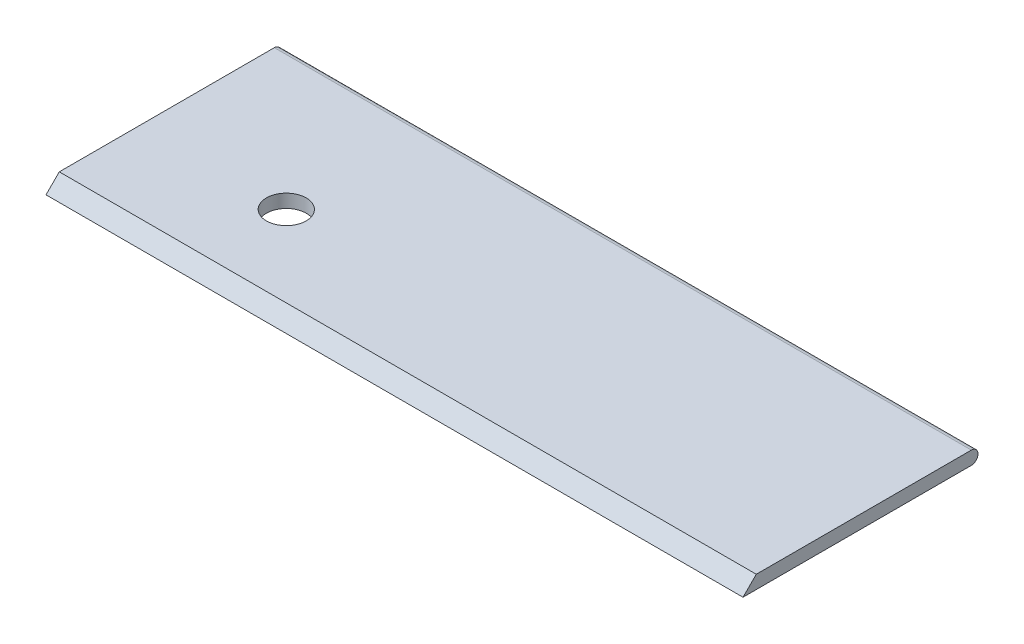
ISO-10303-21;
HEADER;
FILE_DESCRIPTION(('STEP AP214'),'2;1');
FILE_NAME('part.step','',(''),(''),'','','');
FILE_SCHEMA(('AUTOMOTIVE_DESIGN { 1 0 10303 214 1 1 1 1 }'));
ENDSEC;
DATA;
#1=APPLICATION_CONTEXT('core data for automotive mechanical design processes');
#2=APPLICATION_PROTOCOL_DEFINITION('international standard','automotive_design',2000,#1);
#3=PRODUCT_CONTEXT('',#1,'mechanical');
#4=PRODUCT('Part','Part','',(#3));
#5=PRODUCT_RELATED_PRODUCT_CATEGORY('part','',(#4));
#6=PRODUCT_DEFINITION_FORMATION('','',#4);
#7=PRODUCT_DEFINITION_CONTEXT('part definition',#1,'design');
#8=PRODUCT_DEFINITION('design','',#6,#7);
#9=PRODUCT_DEFINITION_SHAPE('','',#8);
#10=(LENGTH_UNIT() NAMED_UNIT(*) SI_UNIT(.MILLI.,.METRE.));
#11=(NAMED_UNIT(*) PLANE_ANGLE_UNIT() SI_UNIT($,.RADIAN.));
#12=(NAMED_UNIT(*) SI_UNIT($,.STERADIAN.) SOLID_ANGLE_UNIT());
#13=UNCERTAINTY_MEASURE_WITH_UNIT(LENGTH_MEASURE(1.E-05),#10,'distance_accuracy_value','');
#14=(GEOMETRIC_REPRESENTATION_CONTEXT(3) GLOBAL_UNCERTAINTY_ASSIGNED_CONTEXT((#13)) GLOBAL_UNIT_ASSIGNED_CONTEXT((#10,
#11,#12)) REPRESENTATION_CONTEXT('',''));
#15=CARTESIAN_POINT('',(0.,0.,0.));
#16=DIRECTION('',(0.,0.,1.));
#17=DIRECTION('',(1.,0.,0.));
#18=AXIS2_PLACEMENT_3D('',#15,#16,#17);
#19=CARTESIAN_POINT('',(0.,0.,0.));
#20=DIRECTION('',(0.,1.,0.));
#21=DIRECTION('',(0.,0.,1.));
#22=AXIS2_PLACEMENT_3D('',#19,#20,#21);
#23=PLANE('',#22);
#24=CARTESIAN_POINT('',(38.1,0.,16.764));
#25=DIRECTION('',(0.,1.,0.));
#26=DIRECTION('',(0.,0.,1.));
#27=AXIS2_PLACEMENT_3D('',#24,#25,#26);
#28=CIRCLE('',#27,1.524);
#29=CARTESIAN_POINT('',(38.1,0.,18.288));
#30=VERTEX_POINT('',#29);
#31=EDGE_CURVE('E549',#30,#30,#28,.T.);
#32=ORIENTED_EDGE('',*,*,#31,.T.);
#33=EDGE_LOOP('',(#32));
#34=FACE_BOUND('',#33,.T.);
#35=CARTESIAN_POINT('',(17.78,0.,16.764));
#36=DIRECTION('',(0.,1.,0.));
#37=DIRECTION('',(0.,0.,1.));
#38=AXIS2_PLACEMENT_3D('',#35,#36,#37);
#39=CIRCLE('',#38,1.524);
#40=CARTESIAN_POINT('',(17.78,0.,18.288));
#41=VERTEX_POINT('',#40);
#42=EDGE_CURVE('E551',#41,#41,#39,.T.);
#43=ORIENTED_EDGE('',*,*,#42,.T.);
#44=EDGE_LOOP('',(#43));
#45=FACE_BOUND('',#44,.T.);
#46=CARTESIAN_POINT('',(20.955,0.,5.9436));
#47=DIRECTION('',(0.,-1.,0.));
#48=DIRECTION('',(0.,0.,-1.));
#49=AXIS2_PLACEMENT_3D('',#46,#47,#48);
#50=CIRCLE('',#49,1.4986);
#51=CARTESIAN_POINT('',(20.955,0.,4.445));
#52=VERTEX_POINT('',#51);
#53=EDGE_CURVE('E218',#52,#52,#50,.T.);
#54=ORIENTED_EDGE('',*,*,#53,.F.);
#55=EDGE_LOOP('',(#54));
#56=FACE_BOUND('',#55,.T.);
#57=CARTESIAN_POINT('',(30.9626,0.,5.9436));
#58=DIRECTION('',(0.,-1.,0.));
#59=DIRECTION('',(0.,0.,-1.));
#60=AXIS2_PLACEMENT_3D('',#57,#58,#59);
#61=CIRCLE('',#60,1.4986);
#62=CARTESIAN_POINT('',(30.9626,0.,4.445));
#63=VERTEX_POINT('',#62);
#64=EDGE_CURVE('E231',#63,#63,#61,.T.);
#65=ORIENTED_EDGE('',*,*,#64,.F.);
#66=EDGE_LOOP('',(#65));
#67=FACE_BOUND('',#66,.T.);
#68=CARTESIAN_POINT('',(102.3874,0.,5.9436));
#69=DIRECTION('',(0.,-1.,0.));
#70=DIRECTION('',(0.,0.,-1.));
#71=AXIS2_PLACEMENT_3D('',#68,#69,#70);
#72=CIRCLE('',#71,1.4986);
#73=CARTESIAN_POINT('',(102.3874,0.,4.44499999999999));
#74=VERTEX_POINT('',#73);
#75=EDGE_CURVE('E237',#74,#74,#72,.T.);
#76=ORIENTED_EDGE('',*,*,#75,.F.);
#77=EDGE_LOOP('',(#76));
#78=FACE_BOUND('',#77,.T.);
#79=CARTESIAN_POINT('',(112.395,0.,5.9436));
#80=DIRECTION('',(0.,-1.,0.));
#81=DIRECTION('',(0.,0.,-1.));
#82=AXIS2_PLACEMENT_3D('',#79,#80,#81);
#83=CIRCLE('',#82,1.4986);
#84=CARTESIAN_POINT('',(112.395,0.,4.44499999999999));
#85=VERTEX_POINT('',#84);
#86=EDGE_CURVE('E243',#85,#85,#83,.T.);
#87=ORIENTED_EDGE('',*,*,#86,.F.);
#88=EDGE_LOOP('',(#87));
#89=FACE_BOUND('',#88,.T.);
#90=DIRECTION('',(0.,0.,1.));
#91=VECTOR('',#90,1.);
#92=CARTESIAN_POINT('',(0.,0.,0.));
#93=LINE('',#92,#91);
#94=CARTESIAN_POINT('',(0.,0.,1.27));
#95=VERTEX_POINT('',#94);
#96=CARTESIAN_POINT('',(0.,0.,44.958));
#97=VERTEX_POINT('',#96);
#98=EDGE_CURVE('E161',#95,#97,#93,.T.);
#99=ORIENTED_EDGE('',*,*,#98,.F.);
#100=DIRECTION('',(-1.,0.,0.));
#101=VECTOR('',#100,1.);
#102=CARTESIAN_POINT('',(0.,0.,1.27));
#103=LINE('',#102,#101);
#104=CARTESIAN_POINT('',(133.35,0.,1.27));
#105=VERTEX_POINT('',#104);
#106=EDGE_CURVE('E11',#95,#105,#103,.F.);
#107=ORIENTED_EDGE('',*,*,#106,.T.);
#108=DIRECTION('',(0.,0.,-1.));
#109=VECTOR('',#108,1.);
#110=CARTESIAN_POINT('',(133.35,0.,0.));
#111=LINE('',#110,#109);
#112=CARTESIAN_POINT('',(133.35,0.,44.958));
#113=VERTEX_POINT('',#112);
#114=EDGE_CURVE('E165',#113,#105,#111,.T.);
#115=ORIENTED_EDGE('',*,*,#114,.F.);
#116=DIRECTION('',(1.,0.,0.));
#117=VECTOR('',#116,1.);
#118=CARTESIAN_POINT('',(0.,0.,44.958));
#119=LINE('',#118,#117);
#120=EDGE_CURVE('E170',#97,#113,#119,.T.);
#121=ORIENTED_EDGE('',*,*,#120,.F.);
#122=EDGE_LOOP('',(#99,#107,#115,#121));
#123=FACE_BOUND('',#122,.T.);
#124=CARTESIAN_POINT('',(27.94,0.,26.924));
#125=DIRECTION('',(0.,1.,0.));
#126=DIRECTION('',(0.,0.,1.));
#127=AXIS2_PLACEMENT_3D('',#124,#125,#126);
#128=CIRCLE('',#127,3.81);
#129=CARTESIAN_POINT('',(27.94,0.,30.734));
#130=VERTEX_POINT('',#129);
#131=EDGE_CURVE('E148',#130,#130,#128,.T.);
#132=ORIENTED_EDGE('',*,*,#131,.T.);
#133=EDGE_LOOP('',(#132));
#134=FACE_BOUND('',#133,.T.);
#135=DIRECTION('',(0.,0.,-1.));
#136=VECTOR('',#135,1.);
#137=CARTESIAN_POINT('',(99.568,0.,27.94));
#138=LINE('',#137,#136);
#139=CARTESIAN_POINT('',(99.568,0.,27.94));
#140=VERTEX_POINT('',#139);
#141=CARTESIAN_POINT('',(99.568,0.,22.86));
#142=VERTEX_POINT('',#141);
#143=EDGE_CURVE('E117',#140,#142,#138,.T.);
#144=ORIENTED_EDGE('',*,*,#143,.F.);
#145=DIRECTION('',(-1.,0.,0.));
#146=VECTOR('',#145,1.);
#147=CARTESIAN_POINT('',(99.568,0.,27.94));
#148=LINE('',#147,#146);
#149=CARTESIAN_POINT('',(102.108,0.,27.94));
#150=VERTEX_POINT('',#149);
#151=EDGE_CURVE('E124',#150,#140,#148,.T.);
#152=ORIENTED_EDGE('',*,*,#151,.F.);
#153=DIRECTION('',(0.,0.,1.));
#154=VECTOR('',#153,1.);
#155=CARTESIAN_POINT('',(102.108,0.,27.94));
#156=LINE('',#155,#154);
#157=CARTESIAN_POINT('',(102.108,0.,22.86));
#158=VERTEX_POINT('',#157);
#159=EDGE_CURVE('E137',#158,#150,#156,.T.);
#160=ORIENTED_EDGE('',*,*,#159,.F.);
#161=DIRECTION('',(1.,0.,0.));
#162=VECTOR('',#161,1.);
#163=CARTESIAN_POINT('',(99.568,0.,22.86));
#164=LINE('',#163,#162);
#165=EDGE_CURVE('E132',#142,#158,#164,.T.);
#166=ORIENTED_EDGE('',*,*,#165,.F.);
#167=EDGE_LOOP('',(#144,#152,#160,#166));
#168=FACE_BOUND('',#167,.T.);
#169=ADVANCED_FACE('F35',(#34,#45,#56,#67,#78,#89,#123,#134,#168),#23,.F.);
#170=CARTESIAN_POINT('',(0.,2.54,0.));
#171=DIRECTION('',(1.,0.,0.));
#172=DIRECTION('',(0.,0.,-1.));
#173=AXIS2_PLACEMENT_3D('',#170,#171,#172);
#174=PLANE('',#173);
#175=DIRECTION('',(0.,0.,1.));
#176=VECTOR('',#175,1.);
#177=CARTESIAN_POINT('',(0.,2.54,0.));
#178=LINE('',#177,#176);
#179=CARTESIAN_POINT('',(0.,2.54,1.27));
#180=VERTEX_POINT('',#179);
#181=CARTESIAN_POINT('',(0.,2.54,42.418));
#182=VERTEX_POINT('',#181);
#183=EDGE_CURVE('E162',#180,#182,#178,.T.);
#184=ORIENTED_EDGE('',*,*,#183,.F.);
#185=CARTESIAN_POINT('',(0.,1.27,1.27));
#186=DIRECTION('',(1.,0.,0.));
#187=DIRECTION('',(0.,0.,-1.));
#188=AXIS2_PLACEMENT_3D('',#185,#186,#187);
#189=CIRCLE('',#188,1.27);
#190=CARTESIAN_POINT('',(0.,1.27,0.));
#191=VERTEX_POINT('',#190);
#192=EDGE_CURVE('E195',#180,#191,#189,.F.);
#193=ORIENTED_EDGE('',*,*,#192,.T.);
#194=CARTESIAN_POINT('',(0.,1.27,1.27));
#195=DIRECTION('',(1.,0.,0.));
#196=DIRECTION('',(0.,0.,-1.));
#197=AXIS2_PLACEMENT_3D('',#194,#195,#196);
#198=CIRCLE('',#197,1.27);
#199=EDGE_CURVE('E193',#191,#95,#198,.F.);
#200=ORIENTED_EDGE('',*,*,#199,.T.);
#201=ORIENTED_EDGE('',*,*,#98,.T.);
#202=DIRECTION('',(0.,0.707106781186544,-0.707106781186552));
#203=VECTOR('',#202,1.);
#204=CARTESIAN_POINT('',(0.,2.54,42.418));
#205=LINE('',#204,#203);
#206=EDGE_CURVE('E154',#97,#182,#205,.T.);
#207=ORIENTED_EDGE('',*,*,#206,.T.);
#208=EDGE_LOOP('',(#184,#193,#200,#201,#207));
#209=FACE_BOUND('',#208,.T.);
#210=ADVANCED_FACE('F212',(#209),#174,.F.);
#211=CARTESIAN_POINT('',(133.35,2.54,0.));
#212=DIRECTION('',(-1.,0.,0.));
#213=DIRECTION('',(0.,0.,1.));
#214=AXIS2_PLACEMENT_3D('',#211,#212,#213);
#215=PLANE('',#214);
#216=CARTESIAN_POINT('',(133.35,1.27,1.27));
#217=DIRECTION('',(-1.,0.,0.));
#218=DIRECTION('',(0.,0.,1.));
#219=AXIS2_PLACEMENT_3D('',#216,#217,#218);
#220=CIRCLE('',#219,1.27);
#221=CARTESIAN_POINT('',(133.35,1.27,0.));
#222=VERTEX_POINT('',#221);
#223=EDGE_CURVE('E51',#105,#222,#220,.F.);
#224=ORIENTED_EDGE('',*,*,#223,.T.);
#225=CARTESIAN_POINT('',(133.35,1.27,1.27));
#226=DIRECTION('',(-1.,0.,0.));
#227=DIRECTION('',(0.,0.,1.));
#228=AXIS2_PLACEMENT_3D('',#225,#226,#227);
#229=CIRCLE('',#228,1.27);
#230=CARTESIAN_POINT('',(133.35,2.54,1.27));
#231=VERTEX_POINT('',#230);
#232=EDGE_CURVE('E44',#222,#231,#229,.F.);
#233=ORIENTED_EDGE('',*,*,#232,.T.);
#234=DIRECTION('',(0.,0.,-1.));
#235=VECTOR('',#234,1.);
#236=CARTESIAN_POINT('',(133.35,2.54,0.));
#237=LINE('',#236,#235);
#238=CARTESIAN_POINT('',(133.35,2.54,42.418));
#239=VERTEX_POINT('',#238);
#240=EDGE_CURVE('E164',#239,#231,#237,.T.);
#241=ORIENTED_EDGE('',*,*,#240,.F.);
#242=DIRECTION('',(0.,0.707106781186544,-0.707106781186552));
#243=VECTOR('',#242,1.);
#244=CARTESIAN_POINT('',(133.35,2.54,42.418));
#245=LINE('',#244,#243);
#246=EDGE_CURVE('E151',#113,#239,#245,.T.);
#247=ORIENTED_EDGE('',*,*,#246,.F.);
#248=ORIENTED_EDGE('',*,*,#114,.T.);
#249=EDGE_LOOP('',(#224,#233,#241,#247,#248));
#250=FACE_BOUND('',#249,.T.);
#251=ADVANCED_FACE('F200',(#250),#215,.F.);
#252=CARTESIAN_POINT('',(0.,2.54,0.));
#253=DIRECTION('',(0.,1.,0.));
#254=DIRECTION('',(0.,0.,1.));
#255=AXIS2_PLACEMENT_3D('',#252,#253,#254);
#256=PLANE('',#255);
#257=CARTESIAN_POINT('',(27.94,2.54,26.924));
#258=DIRECTION('',(0.,1.,0.));
#259=DIRECTION('',(0.,0.,1.));
#260=AXIS2_PLACEMENT_3D('',#257,#258,#259);
#261=CIRCLE('',#260,3.81);
#262=CARTESIAN_POINT('',(27.94,2.54,30.734));
#263=VERTEX_POINT('',#262);
#264=EDGE_CURVE('E147',#263,#263,#261,.T.);
#265=ORIENTED_EDGE('',*,*,#264,.F.);
#266=EDGE_LOOP('',(#265));
#267=FACE_BOUND('',#266,.T.);
#268=ORIENTED_EDGE('',*,*,#240,.T.);
#269=DIRECTION('',(-1.,0.,0.));
#270=VECTOR('',#269,1.);
#271=CARTESIAN_POINT('',(0.,2.54,1.27));
#272=LINE('',#271,#270);
#273=EDGE_CURVE('E190',#231,#180,#272,.T.);
#274=ORIENTED_EDGE('',*,*,#273,.T.);
#275=ORIENTED_EDGE('',*,*,#183,.T.);
#276=DIRECTION('',(1.,0.,0.));
#277=VECTOR('',#276,1.);
#278=CARTESIAN_POINT('',(0.,2.54,42.418));
#279=LINE('',#278,#277);
#280=EDGE_CURVE('E157',#182,#239,#279,.T.);
#281=ORIENTED_EDGE('',*,*,#280,.T.);
#282=EDGE_LOOP('',(#268,#274,#275,#281));
#283=FACE_BOUND('',#282,.T.);
#284=ADVANCED_FACE('F206',(#267,#283),#256,.T.);
#285=CARTESIAN_POINT('',(0.,2.54,42.418));
#286=DIRECTION('',(0.,-0.707106781186551,-0.707106781186543));
#287=DIRECTION('',(0.,0.707106781186544,-0.707106781186552));
#288=AXIS2_PLACEMENT_3D('',#285,#286,#287);
#289=PLANE('',#288);
#290=ORIENTED_EDGE('',*,*,#246,.T.);
#291=ORIENTED_EDGE('',*,*,#280,.F.);
#292=ORIENTED_EDGE('',*,*,#206,.F.);
#293=ORIENTED_EDGE('',*,*,#120,.T.);
#294=EDGE_LOOP('',(#290,#291,#292,#293));
#295=FACE_BOUND('',#294,.T.);
#296=ADVANCED_FACE('F335',(#295),#289,.F.);
#297=CARTESIAN_POINT('',(27.94,0.,26.924));
#298=DIRECTION('',(0.,1.,0.));
#299=DIRECTION('',(0.,0.,1.));
#300=AXIS2_PLACEMENT_3D('',#297,#298,#299);
#301=CYLINDRICAL_SURFACE('',#300,3.81);
#302=ORIENTED_EDGE('',*,*,#131,.F.);
#303=EDGE_LOOP('',(#302));
#304=FACE_BOUND('',#303,.T.);
#305=ORIENTED_EDGE('',*,*,#264,.T.);
#306=EDGE_LOOP('',(#305));
#307=FACE_BOUND('',#306,.T.);
#308=ADVANCED_FACE('F343',(#304,#307),#301,.F.);
#309=CARTESIAN_POINT('',(99.568,-4.572,27.94));
#310=DIRECTION('',(1.,0.,0.));
#311=DIRECTION('',(0.,0.,-1.));
#312=AXIS2_PLACEMENT_3D('',#309,#310,#311);
#313=PLANE('',#312);
#314=CARTESIAN_POINT('',(99.5679999999999,-2.286,25.4));
#315=DIRECTION('',(-1.,0.,0.));
#316=DIRECTION('',(0.,0.,1.));
#317=AXIS2_PLACEMENT_3D('',#314,#315,#316);
#318=CIRCLE('',#317,0.761999999999999);
#319=CARTESIAN_POINT('',(99.5679999999999,-2.286,26.162));
#320=VERTEX_POINT('',#319);
#321=EDGE_CURVE('E175',#320,#320,#318,.T.);
#322=ORIENTED_EDGE('',*,*,#321,.F.);
#323=EDGE_LOOP('',(#322));
#324=FACE_BOUND('',#323,.T.);
#325=DIRECTION('',(0.,1.,0.));
#326=VECTOR('',#325,1.);
#327=CARTESIAN_POINT('',(99.568,-4.572,22.86));
#328=LINE('',#327,#326);
#329=CARTESIAN_POINT('',(99.568,-2.032,22.86));
#330=VERTEX_POINT('',#329);
#331=EDGE_CURVE('E145',#330,#142,#328,.T.);
#332=ORIENTED_EDGE('',*,*,#331,.F.);
#333=CARTESIAN_POINT('',(99.568,-2.032,25.4));
#334=DIRECTION('',(1.,0.,0.));
#335=DIRECTION('',(0.,0.,-1.));
#336=AXIS2_PLACEMENT_3D('',#333,#334,#335);
#337=CIRCLE('',#336,2.54);
#338=CARTESIAN_POINT('',(99.568,-4.572,25.4));
#339=VERTEX_POINT('',#338);
#340=EDGE_CURVE('E188',#330,#339,#337,.F.);
#341=ORIENTED_EDGE('',*,*,#340,.T.);
#342=CARTESIAN_POINT('',(99.568,-2.032,25.4));
#343=DIRECTION('',(1.,0.,0.));
#344=DIRECTION('',(0.,0.,-1.));
#345=AXIS2_PLACEMENT_3D('',#342,#343,#344);
#346=CIRCLE('',#345,2.54);
#347=CARTESIAN_POINT('',(99.568,-2.032,27.94));
#348=VERTEX_POINT('',#347);
#349=EDGE_CURVE('E119',#339,#348,#346,.F.);
#350=ORIENTED_EDGE('',*,*,#349,.T.);
#351=DIRECTION('',(0.,1.,0.));
#352=VECTOR('',#351,1.);
#353=CARTESIAN_POINT('',(99.568,-4.572,27.94));
#354=LINE('',#353,#352);
#355=EDGE_CURVE('E113',#348,#140,#354,.T.);
#356=ORIENTED_EDGE('',*,*,#355,.T.);
#357=ORIENTED_EDGE('',*,*,#143,.T.);
#358=EDGE_LOOP('',(#332,#341,#350,#356,#357));
#359=FACE_BOUND('',#358,.T.);
#360=ADVANCED_FACE('F116',(#324,#359),#313,.F.);
#361=CARTESIAN_POINT('',(99.568,-4.572,22.86));
#362=DIRECTION('',(0.,0.,1.));
#363=DIRECTION('',(1.,0.,0.));
#364=AXIS2_PLACEMENT_3D('',#361,#362,#363);
#365=PLANE('',#364);
#366=DIRECTION('',(0.,1.,0.));
#367=VECTOR('',#366,1.);
#368=CARTESIAN_POINT('',(102.108,-4.572,22.86));
#369=LINE('',#368,#367);
#370=CARTESIAN_POINT('',(102.108,-2.032,22.86));
#371=VERTEX_POINT('',#370);
#372=EDGE_CURVE('E143',#371,#158,#369,.T.);
#373=ORIENTED_EDGE('',*,*,#372,.F.);
#374=DIRECTION('',(1.,0.,0.));
#375=VECTOR('',#374,1.);
#376=CARTESIAN_POINT('',(99.568,-2.032,22.86));
#377=LINE('',#376,#375);
#378=EDGE_CURVE('E186',#371,#330,#377,.F.);
#379=ORIENTED_EDGE('',*,*,#378,.T.);
#380=ORIENTED_EDGE('',*,*,#331,.T.);
#381=ORIENTED_EDGE('',*,*,#165,.T.);
#382=EDGE_LOOP('',(#373,#379,#380,#381));
#383=FACE_BOUND('',#382,.T.);
#384=ADVANCED_FACE('F248',(#383),#365,.F.);
#385=CARTESIAN_POINT('',(102.108,-4.572,27.94));
#386=DIRECTION('',(-1.,0.,0.));
#387=DIRECTION('',(0.,0.,1.));
#388=AXIS2_PLACEMENT_3D('',#385,#386,#387);
#389=PLANE('',#388);
#390=CARTESIAN_POINT('',(102.108,-2.286,25.4));
#391=DIRECTION('',(-1.,0.,0.));
#392=DIRECTION('',(0.,0.,1.));
#393=AXIS2_PLACEMENT_3D('',#390,#391,#392);
#394=CIRCLE('',#393,0.761999999999999);
#395=CARTESIAN_POINT('',(102.108,-2.286,26.162));
#396=VERTEX_POINT('',#395);
#397=EDGE_CURVE('E133',#396,#396,#394,.T.);
#398=ORIENTED_EDGE('',*,*,#397,.T.);
#399=EDGE_LOOP('',(#398));
#400=FACE_BOUND('',#399,.T.);
#401=CARTESIAN_POINT('',(102.108,-2.032,25.4));
#402=DIRECTION('',(-1.,0.,0.));
#403=DIRECTION('',(0.,0.,1.));
#404=AXIS2_PLACEMENT_3D('',#401,#402,#403);
#405=CIRCLE('',#404,2.54);
#406=CARTESIAN_POINT('',(102.108,-2.032,27.94));
#407=VERTEX_POINT('',#406);
#408=CARTESIAN_POINT('',(102.108,-4.572,25.4));
#409=VERTEX_POINT('',#408);
#410=EDGE_CURVE('E181',#407,#409,#405,.F.);
#411=ORIENTED_EDGE('',*,*,#410,.T.);
#412=CARTESIAN_POINT('',(102.108,-2.032,25.4));
#413=DIRECTION('',(-1.,0.,0.));
#414=DIRECTION('',(0.,0.,1.));
#415=AXIS2_PLACEMENT_3D('',#412,#413,#414);
#416=CIRCLE('',#415,2.54);
#417=EDGE_CURVE('E184',#409,#371,#416,.F.);
#418=ORIENTED_EDGE('',*,*,#417,.T.);
#419=ORIENTED_EDGE('',*,*,#372,.T.);
#420=ORIENTED_EDGE('',*,*,#159,.T.);
#421=DIRECTION('',(0.,1.,0.));
#422=VECTOR('',#421,1.);
#423=CARTESIAN_POINT('',(102.108,-4.572,27.94));
#424=LINE('',#423,#422);
#425=EDGE_CURVE('E123',#407,#150,#424,.T.);
#426=ORIENTED_EDGE('',*,*,#425,.F.);
#427=EDGE_LOOP('',(#411,#418,#419,#420,#426));
#428=FACE_BOUND('',#427,.T.);
#429=ADVANCED_FACE('F258',(#400,#428),#389,.F.);
#430=CARTESIAN_POINT('',(99.568,-4.572,27.94));
#431=DIRECTION('',(0.,0.,-1.));
#432=DIRECTION('',(-1.,0.,0.));
#433=AXIS2_PLACEMENT_3D('',#430,#431,#432);
#434=PLANE('',#433);
#435=ORIENTED_EDGE('',*,*,#355,.F.);
#436=DIRECTION('',(-1.,0.,0.));
#437=VECTOR('',#436,1.);
#438=CARTESIAN_POINT('',(102.108,-2.032,27.94));
#439=LINE('',#438,#437);
#440=EDGE_CURVE('E179',#348,#407,#439,.F.);
#441=ORIENTED_EDGE('',*,*,#440,.T.);
#442=ORIENTED_EDGE('',*,*,#425,.T.);
#443=ORIENTED_EDGE('',*,*,#151,.T.);
#444=EDGE_LOOP('',(#435,#441,#442,#443));
#445=FACE_BOUND('',#444,.T.);
#446=ADVANCED_FACE('F135',(#445),#434,.F.);
#447=CARTESIAN_POINT('',(133.35,-2.286,25.4000000000001));
#448=DIRECTION('',(-1.,0.,0.));
#449=DIRECTION('',(0.,0.,1.));
#450=AXIS2_PLACEMENT_3D('',#447,#448,#449);
#451=CYLINDRICAL_SURFACE('',#450,0.761999999999999);
#452=ORIENTED_EDGE('',*,*,#321,.T.);
#453=EDGE_LOOP('',(#452));
#454=FACE_BOUND('',#453,.T.);
#455=ORIENTED_EDGE('',*,*,#397,.F.);
#456=EDGE_LOOP('',(#455));
#457=FACE_BOUND('',#456,.T.);
#458=ADVANCED_FACE('F266',(#454,#457),#451,.F.);
#459=CARTESIAN_POINT('',(0.,-2.032,25.4000000000001));
#460=DIRECTION('',(1.,0.,0.));
#461=DIRECTION('',(0.,0.,-1.));
#462=AXIS2_PLACEMENT_3D('',#459,#460,#461);
#463=CYLINDRICAL_SURFACE('',#462,2.54);
#464=ORIENTED_EDGE('',*,*,#410,.F.);
#465=ORIENTED_EDGE('',*,*,#440,.F.);
#466=ORIENTED_EDGE('',*,*,#349,.F.);
#467=DIRECTION('',(-1.,0.,0.));
#468=VECTOR('',#467,1.);
#469=CARTESIAN_POINT('',(99.568,-4.572,25.4));
#470=LINE('',#469,#468);
#471=EDGE_CURVE('E168',#409,#339,#470,.T.);
#472=ORIENTED_EDGE('',*,*,#471,.F.);
#473=EDGE_LOOP('',(#464,#465,#466,#472));
#474=FACE_BOUND('',#473,.T.);
#475=ADVANCED_FACE('F256',(#474),#463,.T.);
#476=CARTESIAN_POINT('',(0.,-2.032,25.4));
#477=DIRECTION('',(-1.,0.,0.));
#478=DIRECTION('',(0.,0.,1.));
#479=AXIS2_PLACEMENT_3D('',#476,#477,#478);
#480=CYLINDRICAL_SURFACE('',#479,2.54);
#481=ORIENTED_EDGE('',*,*,#340,.F.);
#482=ORIENTED_EDGE('',*,*,#378,.F.);
#483=ORIENTED_EDGE('',*,*,#417,.F.);
#484=ORIENTED_EDGE('',*,*,#471,.T.);
#485=EDGE_LOOP('',(#481,#482,#483,#484));
#486=FACE_BOUND('',#485,.T.);
#487=ADVANCED_FACE('F252',(#486),#480,.T.);
#488=CARTESIAN_POINT('',(0.,1.27,1.27));
#489=DIRECTION('',(-1.,0.,0.));
#490=DIRECTION('',(0.,0.,1.));
#491=AXIS2_PLACEMENT_3D('',#488,#489,#490);
#492=CYLINDRICAL_SURFACE('',#491,1.27);
#493=DIRECTION('',(-1.,0.,0.));
#494=VECTOR('',#493,1.);
#495=CARTESIAN_POINT('',(0.,1.27,0.));
#496=LINE('',#495,#494);
#497=EDGE_CURVE('E39',#222,#191,#496,.T.);
#498=ORIENTED_EDGE('',*,*,#497,.F.);
#499=ORIENTED_EDGE('',*,*,#223,.F.);
#500=ORIENTED_EDGE('',*,*,#106,.F.);
#501=ORIENTED_EDGE('',*,*,#199,.F.);
#502=EDGE_LOOP('',(#498,#499,#500,#501));
#503=FACE_BOUND('',#502,.T.);
#504=ADVANCED_FACE('F37',(#503),#492,.T.);
#505=CARTESIAN_POINT('',(0.,1.27,1.27));
#506=DIRECTION('',(1.,0.,0.));
#507=DIRECTION('',(0.,0.,-1.));
#508=AXIS2_PLACEMENT_3D('',#505,#506,#507);
#509=CYLINDRICAL_SURFACE('',#508,1.27);
#510=ORIENTED_EDGE('',*,*,#232,.F.);
#511=ORIENTED_EDGE('',*,*,#497,.T.);
#512=ORIENTED_EDGE('',*,*,#192,.F.);
#513=ORIENTED_EDGE('',*,*,#273,.F.);
#514=EDGE_LOOP('',(#510,#511,#512,#513));
#515=FACE_BOUND('',#514,.T.);
#516=ADVANCED_FACE('F209',(#515),#509,.T.);
#517=CARTESIAN_POINT('',(112.395,2.032,5.9436));
#518=DIRECTION('',(0.,-1.,0.));
#519=DIRECTION('',(0.,0.,-1.));
#520=AXIS2_PLACEMENT_3D('',#517,#518,#519);
#521=CYLINDRICAL_SURFACE('',#520,1.4986);
#522=CARTESIAN_POINT('',(112.395,2.032,5.9436));
#523=DIRECTION('',(0.,-1.,0.));
#524=DIRECTION('',(0.,0.,-1.));
#525=AXIS2_PLACEMENT_3D('',#522,#523,#524);
#526=CIRCLE('',#525,1.4986);
#527=CARTESIAN_POINT('',(112.395,2.032,4.44499999999999));
#528=VERTEX_POINT('',#527);
#529=EDGE_CURVE('E240',#528,#528,#526,.T.);
#530=ORIENTED_EDGE('',*,*,#529,.F.);
#531=EDGE_LOOP('',(#530));
#532=FACE_BOUND('',#531,.T.);
#533=ORIENTED_EDGE('',*,*,#86,.T.);
#534=EDGE_LOOP('',(#533));
#535=FACE_BOUND('',#534,.T.);
#536=ADVANCED_FACE('F287',(#532,#535),#521,.F.);
#537=CARTESIAN_POINT('',(112.395,2.032,5.9436));
#538=DIRECTION('',(0.,-1.,0.));
#539=DIRECTION('',(0.,0.,-1.));
#540=AXIS2_PLACEMENT_3D('',#537,#538,#539);
#541=PLANE('',#540);
#542=ORIENTED_EDGE('',*,*,#529,.T.);
#543=EDGE_LOOP('',(#542));
#544=FACE_BOUND('',#543,.T.);
#545=ADVANCED_FACE('F292',(#544),#541,.T.);
#546=CARTESIAN_POINT('',(102.3874,2.032,5.9436));
#547=DIRECTION('',(0.,-1.,0.));
#548=DIRECTION('',(0.,0.,-1.));
#549=AXIS2_PLACEMENT_3D('',#546,#547,#548);
#550=CYLINDRICAL_SURFACE('',#549,1.4986);
#551=CARTESIAN_POINT('',(102.3874,2.032,5.9436));
#552=DIRECTION('',(0.,-1.,0.));
#553=DIRECTION('',(0.,0.,-1.));
#554=AXIS2_PLACEMENT_3D('',#551,#552,#553);
#555=CIRCLE('',#554,1.4986);
#556=CARTESIAN_POINT('',(102.3874,2.032,4.44499999999999));
#557=VERTEX_POINT('',#556);
#558=EDGE_CURVE('E234',#557,#557,#555,.T.);
#559=ORIENTED_EDGE('',*,*,#558,.F.);
#560=EDGE_LOOP('',(#559));
#561=FACE_BOUND('',#560,.T.);
#562=ORIENTED_EDGE('',*,*,#75,.T.);
#563=EDGE_LOOP('',(#562));
#564=FACE_BOUND('',#563,.T.);
#565=ADVANCED_FACE('F393',(#561,#564),#550,.F.);
#566=CARTESIAN_POINT('',(102.3874,2.032,5.9436));
#567=DIRECTION('',(0.,-1.,0.));
#568=DIRECTION('',(0.,0.,-1.));
#569=AXIS2_PLACEMENT_3D('',#566,#567,#568);
#570=PLANE('',#569);
#571=ORIENTED_EDGE('',*,*,#558,.T.);
#572=EDGE_LOOP('',(#571));
#573=FACE_BOUND('',#572,.T.);
#574=ADVANCED_FACE('F402',(#573),#570,.T.);
#575=CARTESIAN_POINT('',(30.9626,2.032,5.9436));
#576=DIRECTION('',(0.,-1.,0.));
#577=DIRECTION('',(0.,0.,-1.));
#578=AXIS2_PLACEMENT_3D('',#575,#576,#577);
#579=CYLINDRICAL_SURFACE('',#578,1.4986);
#580=CARTESIAN_POINT('',(30.9626,2.032,5.9436));
#581=DIRECTION('',(0.,-1.,0.));
#582=DIRECTION('',(0.,0.,-1.));
#583=AXIS2_PLACEMENT_3D('',#580,#581,#582);
#584=CIRCLE('',#583,1.4986);
#585=CARTESIAN_POINT('',(30.9626,2.032,4.445));
#586=VERTEX_POINT('',#585);
#587=EDGE_CURVE('E223',#586,#586,#584,.T.);
#588=ORIENTED_EDGE('',*,*,#587,.F.);
#589=EDGE_LOOP('',(#588));
#590=FACE_BOUND('',#589,.T.);
#591=ORIENTED_EDGE('',*,*,#64,.T.);
#592=EDGE_LOOP('',(#591));
#593=FACE_BOUND('',#592,.T.);
#594=ADVANCED_FACE('F412',(#590,#593),#579,.F.);
#595=CARTESIAN_POINT('',(30.9626,2.032,5.9436));
#596=DIRECTION('',(0.,-1.,0.));
#597=DIRECTION('',(0.,0.,-1.));
#598=AXIS2_PLACEMENT_3D('',#595,#596,#597);
#599=PLANE('',#598);
#600=ORIENTED_EDGE('',*,*,#587,.T.);
#601=EDGE_LOOP('',(#600));
#602=FACE_BOUND('',#601,.T.);
#603=ADVANCED_FACE('F421',(#602),#599,.T.);
#604=CARTESIAN_POINT('',(20.955,2.032,5.9436));
#605=DIRECTION('',(0.,-1.,0.));
#606=DIRECTION('',(0.,0.,-1.));
#607=AXIS2_PLACEMENT_3D('',#604,#605,#606);
#608=CYLINDRICAL_SURFACE('',#607,1.4986);
#609=CARTESIAN_POINT('',(20.955,2.032,5.9436));
#610=DIRECTION('',(0.,-1.,0.));
#611=DIRECTION('',(0.,0.,-1.));
#612=AXIS2_PLACEMENT_3D('',#609,#610,#611);
#613=CIRCLE('',#612,1.4986);
#614=CARTESIAN_POINT('',(20.955,2.032,4.445));
#615=VERTEX_POINT('',#614);
#616=EDGE_CURVE('E214',#615,#615,#613,.T.);
#617=ORIENTED_EDGE('',*,*,#616,.F.);
#618=EDGE_LOOP('',(#617));
#619=FACE_BOUND('',#618,.T.);
#620=ORIENTED_EDGE('',*,*,#53,.T.);
#621=EDGE_LOOP('',(#620));
#622=FACE_BOUND('',#621,.T.);
#623=ADVANCED_FACE('F431',(#619,#622),#608,.F.);
#624=CARTESIAN_POINT('',(20.955,2.032,5.9436));
#625=DIRECTION('',(0.,-1.,0.));
#626=DIRECTION('',(0.,0.,-1.));
#627=AXIS2_PLACEMENT_3D('',#624,#625,#626);
#628=PLANE('',#627);
#629=ORIENTED_EDGE('',*,*,#616,.T.);
#630=EDGE_LOOP('',(#629));
#631=FACE_BOUND('',#630,.T.);
#632=ADVANCED_FACE('F440',(#631),#628,.T.);
#633=CARTESIAN_POINT('',(17.78,2.032,16.764));
#634=DIRECTION('',(0.,-1.,0.));
#635=DIRECTION('',(0.,0.,-1.));
#636=AXIS2_PLACEMENT_3D('',#633,#634,#635);
#637=CYLINDRICAL_SURFACE('',#636,1.524);
#638=CARTESIAN_POINT('',(17.78,2.032,16.764));
#639=DIRECTION('',(0.,1.,0.));
#640=DIRECTION('',(0.,0.,1.));
#641=AXIS2_PLACEMENT_3D('',#638,#639,#640);
#642=CIRCLE('',#641,1.524);
#643=CARTESIAN_POINT('',(17.78,2.032,18.288));
#644=VERTEX_POINT('',#643);
#645=EDGE_CURVE('E226',#644,#644,#642,.T.);
#646=ORIENTED_EDGE('',*,*,#645,.T.);
#647=EDGE_LOOP('',(#646));
#648=FACE_BOUND('',#647,.T.);
#649=ORIENTED_EDGE('',*,*,#42,.F.);
#650=EDGE_LOOP('',(#649));
#651=FACE_BOUND('',#650,.T.);
#652=ADVANCED_FACE('F450',(#648,#651),#637,.F.);
#653=CARTESIAN_POINT('',(17.78,2.032,16.764));
#654=DIRECTION('',(0.,1.,0.));
#655=DIRECTION('',(0.,0.,1.));
#656=AXIS2_PLACEMENT_3D('',#653,#654,#655);
#657=PLANE('',#656);
#658=ORIENTED_EDGE('',*,*,#645,.F.);
#659=EDGE_LOOP('',(#658));
#660=FACE_BOUND('',#659,.T.);
#661=ADVANCED_FACE('F459',(#660),#657,.F.);
#662=CARTESIAN_POINT('',(38.1,2.032,16.764));
#663=DIRECTION('',(0.,-1.,0.));
#664=DIRECTION('',(0.,0.,-1.));
#665=AXIS2_PLACEMENT_3D('',#662,#663,#664);
#666=CYLINDRICAL_SURFACE('',#665,1.524);
#667=CARTESIAN_POINT('',(38.1,2.032,16.764));
#668=DIRECTION('',(0.,1.,0.));
#669=DIRECTION('',(0.,0.,1.));
#670=AXIS2_PLACEMENT_3D('',#667,#668,#669);
#671=CIRCLE('',#670,1.524);
#672=CARTESIAN_POINT('',(38.1,2.032,18.288));
#673=VERTEX_POINT('',#672);
#674=EDGE_CURVE('E245',#673,#673,#671,.T.);
#675=ORIENTED_EDGE('',*,*,#674,.T.);
#676=EDGE_LOOP('',(#675));
#677=FACE_BOUND('',#676,.T.);
#678=ORIENTED_EDGE('',*,*,#31,.F.);
#679=EDGE_LOOP('',(#678));
#680=FACE_BOUND('',#679,.T.);
#681=ADVANCED_FACE('F469',(#677,#680),#666,.F.);
#682=CARTESIAN_POINT('',(38.1,2.032,16.764));
#683=DIRECTION('',(0.,1.,0.));
#684=DIRECTION('',(0.,0.,1.));
#685=AXIS2_PLACEMENT_3D('',#682,#683,#684);
#686=PLANE('',#685);
#687=ORIENTED_EDGE('',*,*,#674,.F.);
#688=EDGE_LOOP('',(#687));
#689=FACE_BOUND('',#688,.T.);
#690=ADVANCED_FACE('F478',(#689),#686,.F.);
#691=CLOSED_SHELL('',(#169,#210,#251,#284,#296,#308,#360,#384,#429,#446,#458,#475,#487,#504,
#516,#536,#545,#565,#574,#594,#603,#623,#632,#652,#661,#681,#690));
#692=MANIFOLD_SOLID_BREP('B2',#691);
#693=ADVANCED_BREP_SHAPE_REPRESENTATION('',(#18,#692),#14);
#694=SHAPE_DEFINITION_REPRESENTATION(#9,#693);
ENDSEC;
END-ISO-10303-21;
